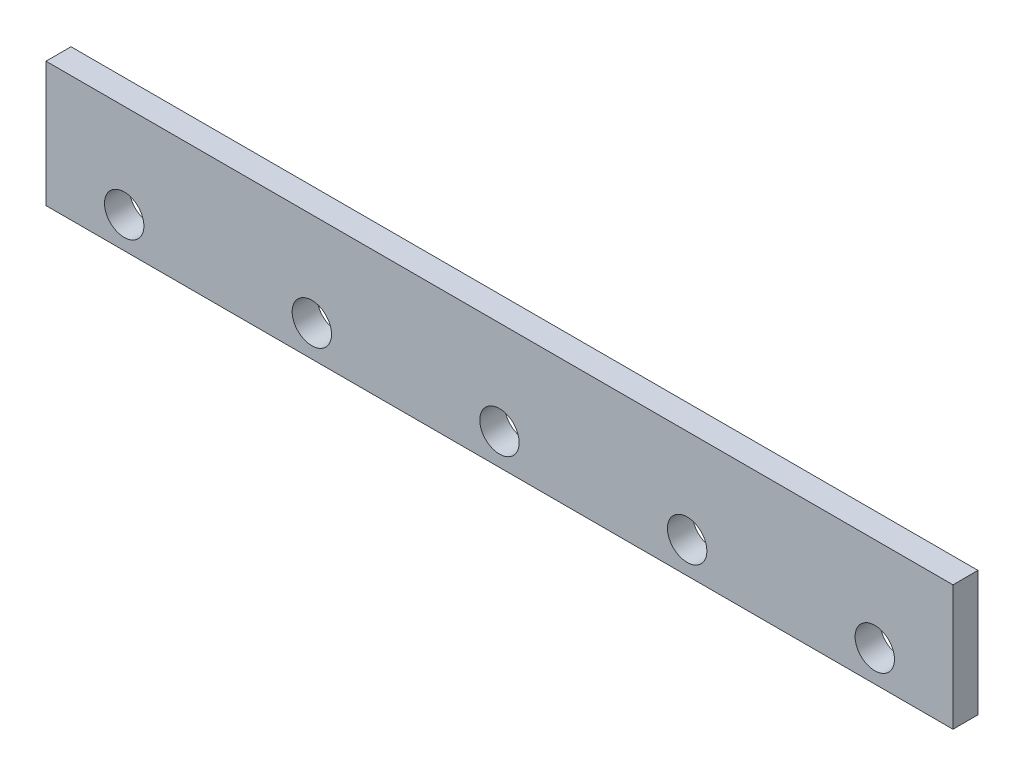
ISO-10303-21;
HEADER;
FILE_DESCRIPTION(('STEP AP214'),'2;1');
FILE_NAME('part.step','',(''),(''),'','','');
FILE_SCHEMA(('AUTOMOTIVE_DESIGN { 1 0 10303 214 1 1 1 1 }'));
ENDSEC;
DATA;
#1=APPLICATION_CONTEXT('core data for automotive mechanical design processes');
#2=APPLICATION_PROTOCOL_DEFINITION('international standard','automotive_design',2000,#1);
#3=PRODUCT_CONTEXT('',#1,'mechanical');
#4=PRODUCT('Part','Part','',(#3));
#5=PRODUCT_RELATED_PRODUCT_CATEGORY('part','',(#4));
#6=PRODUCT_DEFINITION_FORMATION('','',#4);
#7=PRODUCT_DEFINITION_CONTEXT('part definition',#1,'design');
#8=PRODUCT_DEFINITION('design','',#6,#7);
#9=PRODUCT_DEFINITION_SHAPE('','',#8);
#10=(LENGTH_UNIT() NAMED_UNIT(*) SI_UNIT(.MILLI.,.METRE.));
#11=(NAMED_UNIT(*) PLANE_ANGLE_UNIT() SI_UNIT($,.RADIAN.));
#12=(NAMED_UNIT(*) SI_UNIT($,.STERADIAN.) SOLID_ANGLE_UNIT());
#13=UNCERTAINTY_MEASURE_WITH_UNIT(LENGTH_MEASURE(1.E-05),#10,'distance_accuracy_value','');
#14=(GEOMETRIC_REPRESENTATION_CONTEXT(3) GLOBAL_UNCERTAINTY_ASSIGNED_CONTEXT((#13)) GLOBAL_UNIT_ASSIGNED_CONTEXT((#10,
#11,#12)) REPRESENTATION_CONTEXT('',''));
#15=CARTESIAN_POINT('',(0.,0.,0.));
#16=DIRECTION('',(0.,0.,1.));
#17=DIRECTION('',(1.,0.,0.));
#18=AXIS2_PLACEMENT_3D('',#15,#16,#17);
#19=CARTESIAN_POINT('',(0.,79.9999999999999,-16.));
#20=DIRECTION('',(1.,0.,0.));
#21=DIRECTION('',(0.,0.,-1.));
#22=AXIS2_PLACEMENT_3D('',#19,#20,#21);
#23=PLANE('',#22);
#24=DIRECTION('',(0.,1.,0.));
#25=VECTOR('',#24,1.);
#26=CARTESIAN_POINT('',(0.,79.9999999999999,0.));
#27=LINE('',#26,#25);
#28=CARTESIAN_POINT('',(0.,0.,0.));
#29=VERTEX_POINT('',#28);
#30=CARTESIAN_POINT('',(0.,79.9999999999999,0.));
#31=VERTEX_POINT('',#30);
#32=EDGE_CURVE('E103',#29,#31,#27,.T.);
#33=ORIENTED_EDGE('',*,*,#32,.F.);
#34=DIRECTION('',(0.,0.,1.));
#35=VECTOR('',#34,1.);
#36=CARTESIAN_POINT('',(0.,0.,-16.));
#37=LINE('',#36,#35);
#38=CARTESIAN_POINT('',(0.,0.,-16.));
#39=VERTEX_POINT('',#38);
#40=EDGE_CURVE('E11',#39,#29,#37,.T.);
#41=ORIENTED_EDGE('',*,*,#40,.F.);
#42=DIRECTION('',(0.,1.,0.));
#43=VECTOR('',#42,1.);
#44=CARTESIAN_POINT('',(0.,79.9999999999999,-16.));
#45=LINE('',#44,#43);
#46=CARTESIAN_POINT('',(0.,79.9999999999999,-16.));
#47=VERTEX_POINT('',#46);
#48=EDGE_CURVE('E96',#39,#47,#45,.T.);
#49=ORIENTED_EDGE('',*,*,#48,.T.);
#50=DIRECTION('',(0.,0.,1.));
#51=VECTOR('',#50,1.);
#52=CARTESIAN_POINT('',(0.,79.9999999999999,-16.));
#53=LINE('',#52,#51);
#54=EDGE_CURVE('E41',#47,#31,#53,.T.);
#55=ORIENTED_EDGE('',*,*,#54,.T.);
#56=EDGE_LOOP('',(#33,#41,#49,#55));
#57=FACE_BOUND('',#56,.T.);
#58=ADVANCED_FACE('F38',(#57),#23,.T.);
#59=CARTESIAN_POINT('',(0.,0.,-16.));
#60=DIRECTION('',(0.,-1.,0.));
#61=DIRECTION('',(0.,0.,-1.));
#62=AXIS2_PLACEMENT_3D('',#59,#60,#61);
#63=PLANE('',#62);
#64=DIRECTION('',(1.,0.,0.));
#65=VECTOR('',#64,1.);
#66=CARTESIAN_POINT('',(0.,0.,0.));
#67=LINE('',#66,#65);
#68=CARTESIAN_POINT('',(-580.,0.,0.));
#69=VERTEX_POINT('',#68);
#70=EDGE_CURVE('E98',#69,#29,#67,.T.);
#71=ORIENTED_EDGE('',*,*,#70,.F.);
#72=DIRECTION('',(0.,0.,1.));
#73=VECTOR('',#72,1.);
#74=CARTESIAN_POINT('',(-580.,0.,-16.));
#75=LINE('',#74,#73);
#76=CARTESIAN_POINT('',(-580.,0.,-16.));
#77=VERTEX_POINT('',#76);
#78=EDGE_CURVE('E47',#77,#69,#75,.T.);
#79=ORIENTED_EDGE('',*,*,#78,.F.);
#80=DIRECTION('',(1.,0.,0.));
#81=VECTOR('',#80,1.);
#82=CARTESIAN_POINT('',(0.,0.,-16.));
#83=LINE('',#82,#81);
#84=EDGE_CURVE('E93',#77,#39,#83,.T.);
#85=ORIENTED_EDGE('',*,*,#84,.T.);
#86=ORIENTED_EDGE('',*,*,#40,.T.);
#87=EDGE_LOOP('',(#71,#79,#85,#86));
#88=FACE_BOUND('',#87,.T.);
#89=ADVANCED_FACE('F114',(#88),#63,.T.);
#90=CARTESIAN_POINT('',(-580.,0.,-16.));
#91=DIRECTION('',(-1.,0.,0.));
#92=DIRECTION('',(0.,0.,1.));
#93=AXIS2_PLACEMENT_3D('',#90,#91,#92);
#94=PLANE('',#93);
#95=DIRECTION('',(0.,-1.,0.));
#96=VECTOR('',#95,1.);
#97=CARTESIAN_POINT('',(-580.,0.,0.));
#98=LINE('',#97,#96);
#99=CARTESIAN_POINT('',(-580.,79.9999999999999,0.));
#100=VERTEX_POINT('',#99);
#101=EDGE_CURVE('E88',#100,#69,#98,.T.);
#102=ORIENTED_EDGE('',*,*,#101,.F.);
#103=DIRECTION('',(0.,0.,1.));
#104=VECTOR('',#103,1.);
#105=CARTESIAN_POINT('',(-580.,79.9999999999999,-16.));
#106=LINE('',#105,#104);
#107=CARTESIAN_POINT('',(-580.,79.9999999999999,-16.));
#108=VERTEX_POINT('',#107);
#109=EDGE_CURVE('E83',#108,#100,#106,.T.);
#110=ORIENTED_EDGE('',*,*,#109,.F.);
#111=DIRECTION('',(0.,-1.,0.));
#112=VECTOR('',#111,1.);
#113=CARTESIAN_POINT('',(-580.,0.,-16.));
#114=LINE('',#113,#112);
#115=EDGE_CURVE('E86',#108,#77,#114,.T.);
#116=ORIENTED_EDGE('',*,*,#115,.T.);
#117=ORIENTED_EDGE('',*,*,#78,.T.);
#118=EDGE_LOOP('',(#102,#110,#116,#117));
#119=FACE_BOUND('',#118,.T.);
#120=ADVANCED_FACE('F85',(#119),#94,.T.);
#121=CARTESIAN_POINT('',(-580.,79.9999999999999,-16.));
#122=DIRECTION('',(0.,1.,0.));
#123=DIRECTION('',(0.,0.,1.));
#124=AXIS2_PLACEMENT_3D('',#121,#122,#123);
#125=PLANE('',#124);
#126=DIRECTION('',(-1.,0.,0.));
#127=VECTOR('',#126,1.);
#128=CARTESIAN_POINT('',(-580.,79.9999999999999,0.));
#129=LINE('',#128,#127);
#130=EDGE_CURVE('E106',#31,#100,#129,.T.);
#131=ORIENTED_EDGE('',*,*,#130,.F.);
#132=ORIENTED_EDGE('',*,*,#54,.F.);
#133=DIRECTION('',(-1.,0.,0.));
#134=VECTOR('',#133,1.);
#135=CARTESIAN_POINT('',(-580.,79.9999999999999,-16.));
#136=LINE('',#135,#134);
#137=EDGE_CURVE('E92',#47,#108,#136,.T.);
#138=ORIENTED_EDGE('',*,*,#137,.T.);
#139=ORIENTED_EDGE('',*,*,#109,.T.);
#140=EDGE_LOOP('',(#131,#132,#138,#139));
#141=FACE_BOUND('',#140,.T.);
#142=ADVANCED_FACE('F95',(#141),#125,.T.);
#143=CARTESIAN_POINT('',(0.,0.,-16.));
#144=DIRECTION('',(0.,0.,-1.));
#145=DIRECTION('',(-1.,0.,0.));
#146=AXIS2_PLACEMENT_3D('',#143,#144,#145);
#147=PLANE('',#146);
#148=CARTESIAN_POINT('',(-49.9999999999999,19.9999999999999,-16.));
#149=DIRECTION('',(0.,0.,1.));
#150=DIRECTION('',(1.,0.,0.));
#151=AXIS2_PLACEMENT_3D('',#148,#149,#150);
#152=CIRCLE('',#151,12.6000000000001);
#153=CARTESIAN_POINT('',(-37.3999999999999,19.9999999999999,-16.));
#154=VERTEX_POINT('',#153);
#155=EDGE_CURVE('E159',#154,#154,#152,.T.);
#156=ORIENTED_EDGE('',*,*,#155,.T.);
#157=EDGE_LOOP('',(#156));
#158=FACE_BOUND('',#157,.T.);
#159=CARTESIAN_POINT('',(-170.,19.9999999999999,-16.));
#160=DIRECTION('',(0.,0.,1.));
#161=DIRECTION('',(1.,0.,0.));
#162=AXIS2_PLACEMENT_3D('',#159,#160,#161);
#163=CIRCLE('',#162,12.6000000000001);
#164=CARTESIAN_POINT('',(-157.4,19.9999999999999,-16.));
#165=VERTEX_POINT('',#164);
#166=EDGE_CURVE('E167',#165,#165,#163,.T.);
#167=ORIENTED_EDGE('',*,*,#166,.T.);
#168=EDGE_LOOP('',(#167));
#169=FACE_BOUND('',#168,.T.);
#170=CARTESIAN_POINT('',(-290.,19.9999999999999,-16.));
#171=DIRECTION('',(0.,0.,1.));
#172=DIRECTION('',(1.,0.,0.));
#173=AXIS2_PLACEMENT_3D('',#170,#171,#172);
#174=CIRCLE('',#173,12.6000000000001);
#175=CARTESIAN_POINT('',(-277.4,19.9999999999999,-16.));
#176=VERTEX_POINT('',#175);
#177=EDGE_CURVE('E173',#176,#176,#174,.T.);
#178=ORIENTED_EDGE('',*,*,#177,.T.);
#179=EDGE_LOOP('',(#178));
#180=FACE_BOUND('',#179,.T.);
#181=CARTESIAN_POINT('',(-410.,19.9999999999999,-16.));
#182=DIRECTION('',(0.,0.,1.));
#183=DIRECTION('',(1.,0.,0.));
#184=AXIS2_PLACEMENT_3D('',#181,#182,#183);
#185=CIRCLE('',#184,12.6000000000001);
#186=CARTESIAN_POINT('',(-397.4,19.9999999999999,-16.));
#187=VERTEX_POINT('',#186);
#188=EDGE_CURVE('E179',#187,#187,#185,.T.);
#189=ORIENTED_EDGE('',*,*,#188,.T.);
#190=EDGE_LOOP('',(#189));
#191=FACE_BOUND('',#190,.T.);
#192=CARTESIAN_POINT('',(-530.,19.9999999999999,-16.));
#193=DIRECTION('',(0.,0.,1.));
#194=DIRECTION('',(1.,0.,0.));
#195=AXIS2_PLACEMENT_3D('',#192,#193,#194);
#196=CIRCLE('',#195,12.6000000000001);
#197=CARTESIAN_POINT('',(-517.4,19.9999999999999,-16.));
#198=VERTEX_POINT('',#197);
#199=EDGE_CURVE('E107',#198,#198,#196,.T.);
#200=ORIENTED_EDGE('',*,*,#199,.T.);
#201=EDGE_LOOP('',(#200));
#202=FACE_BOUND('',#201,.T.);
#203=ORIENTED_EDGE('',*,*,#48,.F.);
#204=ORIENTED_EDGE('',*,*,#84,.F.);
#205=ORIENTED_EDGE('',*,*,#115,.F.);
#206=ORIENTED_EDGE('',*,*,#137,.F.);
#207=EDGE_LOOP('',(#203,#204,#205,#206));
#208=FACE_BOUND('',#207,.T.);
#209=ADVANCED_FACE('F91',(#158,#169,#180,#191,#202,#208),#147,.T.);
#210=CARTESIAN_POINT('',(0.,0.,0.));
#211=DIRECTION('',(0.,0.,-1.));
#212=DIRECTION('',(-1.,0.,0.));
#213=AXIS2_PLACEMENT_3D('',#210,#211,#212);
#214=PLANE('',#213);
#215=CARTESIAN_POINT('',(-49.9999999999999,19.9999999999999,0.));
#216=DIRECTION('',(0.,0.,1.));
#217=DIRECTION('',(1.,0.,0.));
#218=AXIS2_PLACEMENT_3D('',#215,#216,#217);
#219=CIRCLE('',#218,12.6000000000001);
#220=CARTESIAN_POINT('',(-37.3999999999999,19.9999999999999,0.));
#221=VERTEX_POINT('',#220);
#222=EDGE_CURVE('E162',#221,#221,#219,.T.);
#223=ORIENTED_EDGE('',*,*,#222,.F.);
#224=EDGE_LOOP('',(#223));
#225=FACE_BOUND('',#224,.T.);
#226=CARTESIAN_POINT('',(-170.,19.9999999999999,0.));
#227=DIRECTION('',(0.,0.,1.));
#228=DIRECTION('',(1.,0.,0.));
#229=AXIS2_PLACEMENT_3D('',#226,#227,#228);
#230=CIRCLE('',#229,12.6000000000001);
#231=CARTESIAN_POINT('',(-157.4,19.9999999999999,0.));
#232=VERTEX_POINT('',#231);
#233=EDGE_CURVE('E164',#232,#232,#230,.T.);
#234=ORIENTED_EDGE('',*,*,#233,.F.);
#235=EDGE_LOOP('',(#234));
#236=FACE_BOUND('',#235,.T.);
#237=CARTESIAN_POINT('',(-290.,19.9999999999999,0.));
#238=DIRECTION('',(0.,0.,1.));
#239=DIRECTION('',(1.,0.,0.));
#240=AXIS2_PLACEMENT_3D('',#237,#238,#239);
#241=CIRCLE('',#240,12.6000000000001);
#242=CARTESIAN_POINT('',(-277.4,19.9999999999999,0.));
#243=VERTEX_POINT('',#242);
#244=EDGE_CURVE('E170',#243,#243,#241,.T.);
#245=ORIENTED_EDGE('',*,*,#244,.F.);
#246=EDGE_LOOP('',(#245));
#247=FACE_BOUND('',#246,.T.);
#248=CARTESIAN_POINT('',(-410.,19.9999999999999,0.));
#249=DIRECTION('',(0.,0.,1.));
#250=DIRECTION('',(1.,0.,0.));
#251=AXIS2_PLACEMENT_3D('',#248,#249,#250);
#252=CIRCLE('',#251,12.6000000000001);
#253=CARTESIAN_POINT('',(-397.4,19.9999999999999,0.));
#254=VERTEX_POINT('',#253);
#255=EDGE_CURVE('E176',#254,#254,#252,.T.);
#256=ORIENTED_EDGE('',*,*,#255,.F.);
#257=EDGE_LOOP('',(#256));
#258=FACE_BOUND('',#257,.T.);
#259=CARTESIAN_POINT('',(-530.,19.9999999999999,0.));
#260=DIRECTION('',(0.,0.,1.));
#261=DIRECTION('',(1.,0.,0.));
#262=AXIS2_PLACEMENT_3D('',#259,#260,#261);
#263=CIRCLE('',#262,12.6000000000001);
#264=CARTESIAN_POINT('',(-517.4,19.9999999999999,0.));
#265=VERTEX_POINT('',#264);
#266=EDGE_CURVE('E182',#265,#265,#263,.T.);
#267=ORIENTED_EDGE('',*,*,#266,.F.);
#268=EDGE_LOOP('',(#267));
#269=FACE_BOUND('',#268,.T.);
#270=ORIENTED_EDGE('',*,*,#32,.T.);
#271=ORIENTED_EDGE('',*,*,#130,.T.);
#272=ORIENTED_EDGE('',*,*,#101,.T.);
#273=ORIENTED_EDGE('',*,*,#70,.T.);
#274=EDGE_LOOP('',(#270,#271,#272,#273));
#275=FACE_BOUND('',#274,.T.);
#276=ADVANCED_FACE('F113',(#225,#236,#247,#258,#269,#275),#214,.F.);
#277=CARTESIAN_POINT('',(-530.,19.9999999999999,-16.));
#278=DIRECTION('',(0.,0.,1.));
#279=DIRECTION('',(1.,0.,0.));
#280=AXIS2_PLACEMENT_3D('',#277,#278,#279);
#281=CYLINDRICAL_SURFACE('',#280,12.6000000000001);
#282=ORIENTED_EDGE('',*,*,#199,.F.);
#283=EDGE_LOOP('',(#282));
#284=FACE_BOUND('',#283,.T.);
#285=ORIENTED_EDGE('',*,*,#266,.T.);
#286=EDGE_LOOP('',(#285));
#287=FACE_BOUND('',#286,.T.);
#288=ADVANCED_FACE('F132',(#284,#287),#281,.F.);
#289=CARTESIAN_POINT('',(-410.,19.9999999999999,-16.));
#290=DIRECTION('',(0.,0.,1.));
#291=DIRECTION('',(1.,0.,0.));
#292=AXIS2_PLACEMENT_3D('',#289,#290,#291);
#293=CYLINDRICAL_SURFACE('',#292,12.6000000000001);
#294=ORIENTED_EDGE('',*,*,#188,.F.);
#295=EDGE_LOOP('',(#294));
#296=FACE_BOUND('',#295,.T.);
#297=ORIENTED_EDGE('',*,*,#255,.T.);
#298=EDGE_LOOP('',(#297));
#299=FACE_BOUND('',#298,.T.);
#300=ADVANCED_FACE('F139',(#296,#299),#293,.F.);
#301=CARTESIAN_POINT('',(-290.,19.9999999999999,-16.));
#302=DIRECTION('',(0.,0.,1.));
#303=DIRECTION('',(1.,0.,0.));
#304=AXIS2_PLACEMENT_3D('',#301,#302,#303);
#305=CYLINDRICAL_SURFACE('',#304,12.6000000000001);
#306=ORIENTED_EDGE('',*,*,#177,.F.);
#307=EDGE_LOOP('',(#306));
#308=FACE_BOUND('',#307,.T.);
#309=ORIENTED_EDGE('',*,*,#244,.T.);
#310=EDGE_LOOP('',(#309));
#311=FACE_BOUND('',#310,.T.);
#312=ADVANCED_FACE('F143',(#308,#311),#305,.F.);
#313=CARTESIAN_POINT('',(-170.,19.9999999999999,-16.));
#314=DIRECTION('',(0.,0.,1.));
#315=DIRECTION('',(1.,0.,0.));
#316=AXIS2_PLACEMENT_3D('',#313,#314,#315);
#317=CYLINDRICAL_SURFACE('',#316,12.6000000000001);
#318=ORIENTED_EDGE('',*,*,#166,.F.);
#319=EDGE_LOOP('',(#318));
#320=FACE_BOUND('',#319,.T.);
#321=ORIENTED_EDGE('',*,*,#233,.T.);
#322=EDGE_LOOP('',(#321));
#323=FACE_BOUND('',#322,.T.);
#324=ADVANCED_FACE('F147',(#320,#323),#317,.F.);
#325=CARTESIAN_POINT('',(-49.9999999999999,19.9999999999999,-16.));
#326=DIRECTION('',(0.,0.,1.));
#327=DIRECTION('',(1.,0.,0.));
#328=AXIS2_PLACEMENT_3D('',#325,#326,#327);
#329=CYLINDRICAL_SURFACE('',#328,12.6000000000001);
#330=ORIENTED_EDGE('',*,*,#155,.F.);
#331=EDGE_LOOP('',(#330));
#332=FACE_BOUND('',#331,.T.);
#333=ORIENTED_EDGE('',*,*,#222,.T.);
#334=EDGE_LOOP('',(#333));
#335=FACE_BOUND('',#334,.T.);
#336=ADVANCED_FACE('F151',(#332,#335),#329,.F.);
#337=CLOSED_SHELL('',(#58,#89,#120,#142,#209,#276,#288,#300,#312,#324,#336));
#338=MANIFOLD_SOLID_BREP('B2',#337);
#339=ADVANCED_BREP_SHAPE_REPRESENTATION('',(#18,#338),#14);
#340=SHAPE_DEFINITION_REPRESENTATION(#9,#339);
ENDSEC;
END-ISO-10303-21;
